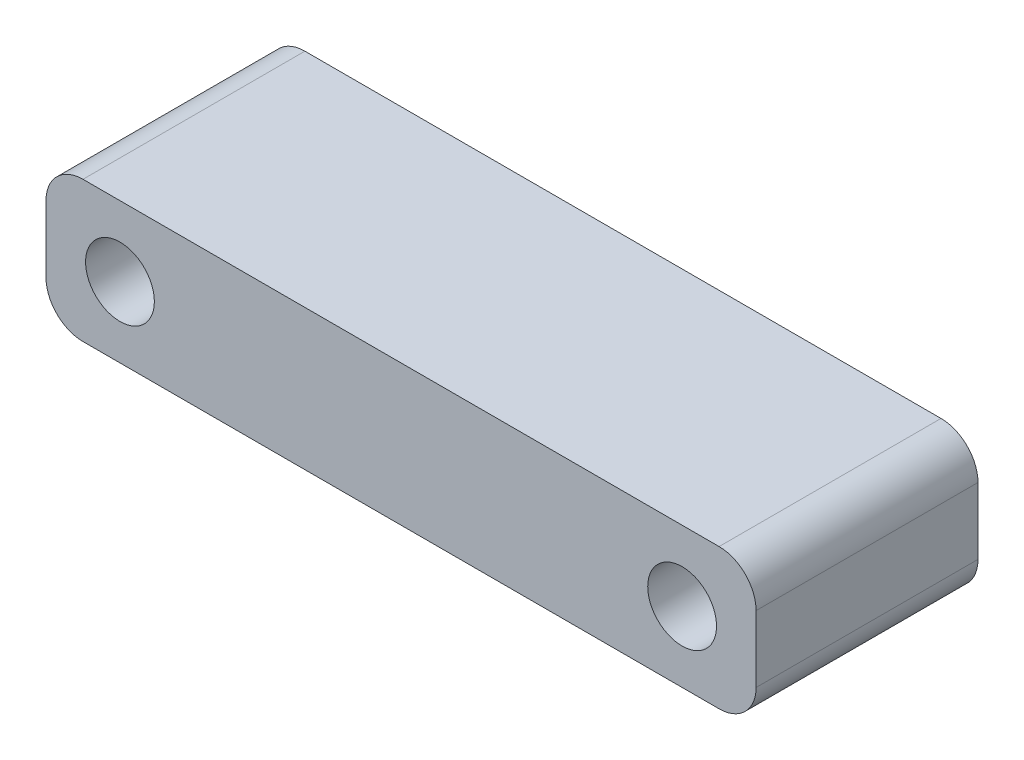
ISO-10303-21;
HEADER;
FILE_DESCRIPTION(('STEP AP214'),'2;1');
FILE_NAME('part.step','',(''),(''),'','','');
FILE_SCHEMA(('AUTOMOTIVE_DESIGN { 1 0 10303 214 1 1 1 1 }'));
ENDSEC;
DATA;
#1=APPLICATION_CONTEXT('core data for automotive mechanical design processes');
#2=APPLICATION_PROTOCOL_DEFINITION('international standard','automotive_design',2000,#1);
#3=PRODUCT_CONTEXT('',#1,'mechanical');
#4=PRODUCT('Part','Part','',(#3));
#5=PRODUCT_RELATED_PRODUCT_CATEGORY('part','',(#4));
#6=PRODUCT_DEFINITION_FORMATION('','',#4);
#7=PRODUCT_DEFINITION_CONTEXT('part definition',#1,'design');
#8=PRODUCT_DEFINITION('design','',#6,#7);
#9=PRODUCT_DEFINITION_SHAPE('','',#8);
#10=(LENGTH_UNIT() NAMED_UNIT(*) SI_UNIT(.MILLI.,.METRE.));
#11=(NAMED_UNIT(*) PLANE_ANGLE_UNIT() SI_UNIT($,.RADIAN.));
#12=(NAMED_UNIT(*) SI_UNIT($,.STERADIAN.) SOLID_ANGLE_UNIT());
#13=UNCERTAINTY_MEASURE_WITH_UNIT(LENGTH_MEASURE(1.E-05),#10,'distance_accuracy_value','');
#14=(GEOMETRIC_REPRESENTATION_CONTEXT(3) GLOBAL_UNCERTAINTY_ASSIGNED_CONTEXT((#13)) GLOBAL_UNIT_ASSIGNED_CONTEXT((#10,
#11,#12)) REPRESENTATION_CONTEXT('',''));
#15=CARTESIAN_POINT('',(0.,0.,0.));
#16=DIRECTION('',(0.,0.,1.));
#17=DIRECTION('',(1.,0.,0.));
#18=AXIS2_PLACEMENT_3D('',#15,#16,#17);
#19=CARTESIAN_POINT('',(0.,0.,30.));
#20=DIRECTION('',(0.,0.,1.));
#21=DIRECTION('',(1.,0.,0.));
#22=AXIS2_PLACEMENT_3D('',#19,#20,#21);
#23=PLANE('',#22);
#24=CARTESIAN_POINT('',(-38.,0.,30.));
#25=DIRECTION('',(0.,0.,1.));
#26=DIRECTION('',(1.,0.,0.));
#27=AXIS2_PLACEMENT_3D('',#24,#25,#26);
#28=CIRCLE('',#27,4.65);
#29=CARTESIAN_POINT('',(-33.35,0.,30.));
#30=VERTEX_POINT('',#29);
#31=EDGE_CURVE('E176',#30,#30,#28,.T.);
#32=ORIENTED_EDGE('',*,*,#31,.F.);
#33=EDGE_LOOP('',(#32));
#34=FACE_BOUND('',#33,.T.);
#35=DIRECTION('',(0.,-1.,0.));
#36=VECTOR('',#35,1.);
#37=CARTESIAN_POINT('',(-48.,9.5,30.));
#38=LINE('',#37,#36);
#39=CARTESIAN_POINT('',(-48.,4.5,30.));
#40=VERTEX_POINT('',#39);
#41=CARTESIAN_POINT('',(-48.,-4.5,30.));
#42=VERTEX_POINT('',#41);
#43=EDGE_CURVE('E180',#40,#42,#38,.T.);
#44=ORIENTED_EDGE('',*,*,#43,.T.);
#45=CARTESIAN_POINT('',(-43.,-4.5,30.));
#46=DIRECTION('',(0.,0.,1.));
#47=DIRECTION('',(1.,0.,0.));
#48=AXIS2_PLACEMENT_3D('',#45,#46,#47);
#49=CIRCLE('',#48,5.);
#50=CARTESIAN_POINT('',(-43.,-9.5,30.));
#51=VERTEX_POINT('',#50);
#52=EDGE_CURVE('E157',#42,#51,#49,.T.);
#53=ORIENTED_EDGE('',*,*,#52,.T.);
#54=DIRECTION('',(1.,0.,0.));
#55=VECTOR('',#54,1.);
#56=CARTESIAN_POINT('',(-48.,-9.5,30.));
#57=LINE('',#56,#55);
#58=CARTESIAN_POINT('',(43.,-9.5,30.));
#59=VERTEX_POINT('',#58);
#60=EDGE_CURVE('E128',#51,#59,#57,.T.);
#61=ORIENTED_EDGE('',*,*,#60,.T.);
#62=CARTESIAN_POINT('',(43.,-4.5,30.));
#63=DIRECTION('',(0.,0.,1.));
#64=DIRECTION('',(1.,0.,0.));
#65=AXIS2_PLACEMENT_3D('',#62,#63,#64);
#66=CIRCLE('',#65,5.);
#67=CARTESIAN_POINT('',(48.,-4.5,30.));
#68=VERTEX_POINT('',#67);
#69=EDGE_CURVE('E153',#59,#68,#66,.T.);
#70=ORIENTED_EDGE('',*,*,#69,.T.);
#71=DIRECTION('',(0.,1.,0.));
#72=VECTOR('',#71,1.);
#73=CARTESIAN_POINT('',(48.,9.5,30.));
#74=LINE('',#73,#72);
#75=CARTESIAN_POINT('',(48.,4.5,30.));
#76=VERTEX_POINT('',#75);
#77=EDGE_CURVE('E136',#68,#76,#74,.T.);
#78=ORIENTED_EDGE('',*,*,#77,.T.);
#79=CARTESIAN_POINT('',(43.,4.5,30.));
#80=DIRECTION('',(0.,0.,1.));
#81=DIRECTION('',(1.,0.,0.));
#82=AXIS2_PLACEMENT_3D('',#79,#80,#81);
#83=CIRCLE('',#82,5.);
#84=CARTESIAN_POINT('',(43.,9.5,30.));
#85=VERTEX_POINT('',#84);
#86=EDGE_CURVE('E63',#76,#85,#83,.T.);
#87=ORIENTED_EDGE('',*,*,#86,.T.);
#88=DIRECTION('',(-1.,0.,0.));
#89=VECTOR('',#88,1.);
#90=CARTESIAN_POINT('',(-48.,9.5,30.));
#91=LINE('',#90,#89);
#92=CARTESIAN_POINT('',(-43.,9.5,30.));
#93=VERTEX_POINT('',#92);
#94=EDGE_CURVE('E139',#85,#93,#91,.T.);
#95=ORIENTED_EDGE('',*,*,#94,.T.);
#96=CARTESIAN_POINT('',(-43.,4.5,30.));
#97=DIRECTION('',(0.,0.,1.));
#98=DIRECTION('',(1.,0.,0.));
#99=AXIS2_PLACEMENT_3D('',#96,#97,#98);
#100=CIRCLE('',#99,5.);
#101=EDGE_CURVE('E155',#93,#40,#100,.T.);
#102=ORIENTED_EDGE('',*,*,#101,.T.);
#103=EDGE_LOOP('',(#44,#53,#61,#70,#78,#87,#95,#102));
#104=FACE_BOUND('',#103,.T.);
#105=CARTESIAN_POINT('',(38.,0.,30.));
#106=DIRECTION('',(0.,0.,1.));
#107=DIRECTION('',(-1.,0.,0.));
#108=AXIS2_PLACEMENT_3D('',#105,#106,#107);
#109=CIRCLE('',#108,4.65);
#110=CARTESIAN_POINT('',(33.35,0.,30.));
#111=VERTEX_POINT('',#110);
#112=EDGE_CURVE('E186',#111,#111,#109,.T.);
#113=ORIENTED_EDGE('',*,*,#112,.F.);
#114=EDGE_LOOP('',(#113));
#115=FACE_BOUND('',#114,.T.);
#116=ADVANCED_FACE('F41',(#34,#104,#115),#23,.T.);
#117=CARTESIAN_POINT('',(0.,0.,0.));
#118=DIRECTION('',(0.,0.,1.));
#119=DIRECTION('',(1.,0.,0.));
#120=AXIS2_PLACEMENT_3D('',#117,#118,#119);
#121=PLANE('',#120);
#122=DIRECTION('',(1.,0.,0.));
#123=VECTOR('',#122,1.);
#124=CARTESIAN_POINT('',(-48.,-9.5,0.));
#125=LINE('',#124,#123);
#126=CARTESIAN_POINT('',(-43.,-9.5,0.));
#127=VERTEX_POINT('',#126);
#128=CARTESIAN_POINT('',(43.,-9.5,0.));
#129=VERTEX_POINT('',#128);
#130=EDGE_CURVE('E125',#127,#129,#125,.T.);
#131=ORIENTED_EDGE('',*,*,#130,.F.);
#132=CARTESIAN_POINT('',(-43.,-4.5,0.));
#133=DIRECTION('',(0.,0.,1.));
#134=DIRECTION('',(1.,0.,0.));
#135=AXIS2_PLACEMENT_3D('',#132,#133,#134);
#136=CIRCLE('',#135,5.);
#137=CARTESIAN_POINT('',(-48.,-4.5,0.));
#138=VERTEX_POINT('',#137);
#139=EDGE_CURVE('E108',#127,#138,#136,.F.);
#140=ORIENTED_EDGE('',*,*,#139,.T.);
#141=DIRECTION('',(0.,-1.,0.));
#142=VECTOR('',#141,1.);
#143=CARTESIAN_POINT('',(-48.,9.5,0.));
#144=LINE('',#143,#142);
#145=CARTESIAN_POINT('',(-48.,4.5,0.));
#146=VERTEX_POINT('',#145);
#147=EDGE_CURVE('E137',#146,#138,#144,.T.);
#148=ORIENTED_EDGE('',*,*,#147,.F.);
#149=CARTESIAN_POINT('',(-43.,4.5,0.));
#150=DIRECTION('',(0.,0.,1.));
#151=DIRECTION('',(1.,0.,0.));
#152=AXIS2_PLACEMENT_3D('',#149,#150,#151);
#153=CIRCLE('',#152,5.);
#154=CARTESIAN_POINT('',(-43.,9.5,0.));
#155=VERTEX_POINT('',#154);
#156=EDGE_CURVE('E119',#146,#155,#153,.F.);
#157=ORIENTED_EDGE('',*,*,#156,.T.);
#158=DIRECTION('',(-1.,0.,0.));
#159=VECTOR('',#158,1.);
#160=CARTESIAN_POINT('',(-48.,9.5,0.));
#161=LINE('',#160,#159);
#162=CARTESIAN_POINT('',(43.,9.5,0.));
#163=VERTEX_POINT('',#162);
#164=EDGE_CURVE('E141',#163,#155,#161,.T.);
#165=ORIENTED_EDGE('',*,*,#164,.F.);
#166=CARTESIAN_POINT('',(43.,4.5,0.));
#167=DIRECTION('',(0.,0.,1.));
#168=DIRECTION('',(1.,0.,0.));
#169=AXIS2_PLACEMENT_3D('',#166,#167,#168);
#170=CIRCLE('',#169,5.);
#171=CARTESIAN_POINT('',(48.,4.5,0.));
#172=VERTEX_POINT('',#171);
#173=EDGE_CURVE('E129',#163,#172,#170,.F.);
#174=ORIENTED_EDGE('',*,*,#173,.T.);
#175=DIRECTION('',(0.,1.,0.));
#176=VECTOR('',#175,1.);
#177=CARTESIAN_POINT('',(48.,9.5,0.));
#178=LINE('',#177,#176);
#179=CARTESIAN_POINT('',(48.,-4.5,0.));
#180=VERTEX_POINT('',#179);
#181=EDGE_CURVE('E168',#180,#172,#178,.T.);
#182=ORIENTED_EDGE('',*,*,#181,.F.);
#183=CARTESIAN_POINT('',(43.,-4.5,0.));
#184=DIRECTION('',(0.,0.,1.));
#185=DIRECTION('',(1.,0.,0.));
#186=AXIS2_PLACEMENT_3D('',#183,#184,#185);
#187=CIRCLE('',#186,5.);
#188=EDGE_CURVE('E135',#180,#129,#187,.F.);
#189=ORIENTED_EDGE('',*,*,#188,.T.);
#190=EDGE_LOOP('',(#131,#140,#148,#157,#165,#174,#182,#189));
#191=FACE_BOUND('',#190,.T.);
#192=CARTESIAN_POINT('',(-38.,0.,0.));
#193=DIRECTION('',(0.,0.,1.));
#194=DIRECTION('',(1.,0.,0.));
#195=AXIS2_PLACEMENT_3D('',#192,#193,#194);
#196=CIRCLE('',#195,4.65);
#197=CARTESIAN_POINT('',(-33.35,0.,0.));
#198=VERTEX_POINT('',#197);
#199=EDGE_CURVE('E183',#198,#198,#196,.T.);
#200=ORIENTED_EDGE('',*,*,#199,.T.);
#201=EDGE_LOOP('',(#200));
#202=FACE_BOUND('',#201,.T.);
#203=CARTESIAN_POINT('',(38.,0.,0.));
#204=DIRECTION('',(0.,0.,1.));
#205=DIRECTION('',(-1.,0.,0.));
#206=AXIS2_PLACEMENT_3D('',#203,#204,#205);
#207=CIRCLE('',#206,4.65);
#208=CARTESIAN_POINT('',(33.35,0.,0.));
#209=VERTEX_POINT('',#208);
#210=EDGE_CURVE('E189',#209,#209,#207,.T.);
#211=ORIENTED_EDGE('',*,*,#210,.T.);
#212=EDGE_LOOP('',(#211));
#213=FACE_BOUND('',#212,.T.);
#214=ADVANCED_FACE('F132',(#191,#202,#213),#121,.F.);
#215=CARTESIAN_POINT('',(48.,9.5,30.));
#216=DIRECTION('',(-1.,0.,0.));
#217=DIRECTION('',(0.,0.,1.));
#218=AXIS2_PLACEMENT_3D('',#215,#216,#217);
#219=PLANE('',#218);
#220=ORIENTED_EDGE('',*,*,#77,.F.);
#221=DIRECTION('',(0.,0.,-1.));
#222=VECTOR('',#221,1.);
#223=CARTESIAN_POINT('',(48.,-4.5,30.));
#224=LINE('',#223,#222);
#225=EDGE_CURVE('E11',#68,#180,#224,.T.);
#226=ORIENTED_EDGE('',*,*,#225,.T.);
#227=ORIENTED_EDGE('',*,*,#181,.T.);
#228=DIRECTION('',(0.,0.,-1.));
#229=VECTOR('',#228,1.);
#230=CARTESIAN_POINT('',(48.,4.5,30.));
#231=LINE('',#230,#229);
#232=EDGE_CURVE('E49',#172,#76,#231,.F.);
#233=ORIENTED_EDGE('',*,*,#232,.T.);
#234=EDGE_LOOP('',(#220,#226,#227,#233));
#235=FACE_BOUND('',#234,.T.);
#236=ADVANCED_FACE('F166',(#235),#219,.F.);
#237=CARTESIAN_POINT('',(-48.,9.5,30.));
#238=DIRECTION('',(0.,-1.,0.));
#239=DIRECTION('',(0.,0.,-1.));
#240=AXIS2_PLACEMENT_3D('',#237,#238,#239);
#241=PLANE('',#240);
#242=ORIENTED_EDGE('',*,*,#164,.T.);
#243=DIRECTION('',(0.,0.,-1.));
#244=VECTOR('',#243,1.);
#245=CARTESIAN_POINT('',(-43.,9.5,30.));
#246=LINE('',#245,#244);
#247=EDGE_CURVE('E56',#155,#93,#246,.F.);
#248=ORIENTED_EDGE('',*,*,#247,.T.);
#249=ORIENTED_EDGE('',*,*,#94,.F.);
#250=DIRECTION('',(0.,0.,-1.));
#251=VECTOR('',#250,1.);
#252=CARTESIAN_POINT('',(43.,9.5,30.));
#253=LINE('',#252,#251);
#254=EDGE_CURVE('E159',#85,#163,#253,.T.);
#255=ORIENTED_EDGE('',*,*,#254,.T.);
#256=EDGE_LOOP('',(#242,#248,#249,#255));
#257=FACE_BOUND('',#256,.T.);
#258=ADVANCED_FACE('F175',(#257),#241,.F.);
#259=CARTESIAN_POINT('',(-48.,9.5,30.));
#260=DIRECTION('',(1.,0.,0.));
#261=DIRECTION('',(0.,0.,-1.));
#262=AXIS2_PLACEMENT_3D('',#259,#260,#261);
#263=PLANE('',#262);
#264=ORIENTED_EDGE('',*,*,#147,.T.);
#265=DIRECTION('',(0.,0.,-1.));
#266=VECTOR('',#265,1.);
#267=CARTESIAN_POINT('',(-48.,-4.5,30.));
#268=LINE('',#267,#266);
#269=EDGE_CURVE('E113',#138,#42,#268,.F.);
#270=ORIENTED_EDGE('',*,*,#269,.T.);
#271=ORIENTED_EDGE('',*,*,#43,.F.);
#272=DIRECTION('',(0.,0.,-1.));
#273=VECTOR('',#272,1.);
#274=CARTESIAN_POINT('',(-48.,4.5,30.));
#275=LINE('',#274,#273);
#276=EDGE_CURVE('E118',#40,#146,#275,.T.);
#277=ORIENTED_EDGE('',*,*,#276,.T.);
#278=EDGE_LOOP('',(#264,#270,#271,#277));
#279=FACE_BOUND('',#278,.T.);
#280=ADVANCED_FACE('F212',(#279),#263,.F.);
#281=CARTESIAN_POINT('',(-48.,-9.5,30.));
#282=DIRECTION('',(0.,1.,0.));
#283=DIRECTION('',(0.,0.,1.));
#284=AXIS2_PLACEMENT_3D('',#281,#282,#283);
#285=PLANE('',#284);
#286=ORIENTED_EDGE('',*,*,#60,.F.);
#287=DIRECTION('',(0.,0.,-1.));
#288=VECTOR('',#287,1.);
#289=CARTESIAN_POINT('',(-43.,-9.5,30.));
#290=LINE('',#289,#288);
#291=EDGE_CURVE('E112',#51,#127,#290,.T.);
#292=ORIENTED_EDGE('',*,*,#291,.T.);
#293=ORIENTED_EDGE('',*,*,#130,.T.);
#294=DIRECTION('',(0.,0.,-1.));
#295=VECTOR('',#294,1.);
#296=CARTESIAN_POINT('',(43.,-9.5,30.));
#297=LINE('',#296,#295);
#298=EDGE_CURVE('E130',#129,#59,#297,.F.);
#299=ORIENTED_EDGE('',*,*,#298,.T.);
#300=EDGE_LOOP('',(#286,#292,#293,#299));
#301=FACE_BOUND('',#300,.T.);
#302=ADVANCED_FACE('F124',(#301),#285,.F.);
#303=CARTESIAN_POINT('',(-38.,0.,30.));
#304=DIRECTION('',(0.,0.,-1.));
#305=DIRECTION('',(-1.,0.,0.));
#306=AXIS2_PLACEMENT_3D('',#303,#304,#305);
#307=CYLINDRICAL_SURFACE('',#306,4.65);
#308=ORIENTED_EDGE('',*,*,#31,.T.);
#309=EDGE_LOOP('',(#308));
#310=FACE_BOUND('',#309,.T.);
#311=ORIENTED_EDGE('',*,*,#199,.F.);
#312=EDGE_LOOP('',(#311));
#313=FACE_BOUND('',#312,.T.);
#314=ADVANCED_FACE('F207',(#310,#313),#307,.F.);
#315=CARTESIAN_POINT('',(38.,0.,30.));
#316=DIRECTION('',(0.,0.,-1.));
#317=DIRECTION('',(-1.,0.,0.));
#318=AXIS2_PLACEMENT_3D('',#315,#316,#317);
#319=CYLINDRICAL_SURFACE('',#318,4.65);
#320=ORIENTED_EDGE('',*,*,#112,.T.);
#321=EDGE_LOOP('',(#320));
#322=FACE_BOUND('',#321,.T.);
#323=ORIENTED_EDGE('',*,*,#210,.F.);
#324=EDGE_LOOP('',(#323));
#325=FACE_BOUND('',#324,.T.);
#326=ADVANCED_FACE('F195',(#322,#325),#319,.F.);
#327=CARTESIAN_POINT('',(-43.,-4.5,30.));
#328=DIRECTION('',(0.,0.,-1.));
#329=DIRECTION('',(-1.,0.,0.));
#330=AXIS2_PLACEMENT_3D('',#327,#328,#329);
#331=CYLINDRICAL_SURFACE('',#330,5.);
#332=ORIENTED_EDGE('',*,*,#52,.F.);
#333=ORIENTED_EDGE('',*,*,#269,.F.);
#334=ORIENTED_EDGE('',*,*,#139,.F.);
#335=ORIENTED_EDGE('',*,*,#291,.F.);
#336=EDGE_LOOP('',(#332,#333,#334,#335));
#337=FACE_BOUND('',#336,.T.);
#338=ADVANCED_FACE('F111',(#337),#331,.T.);
#339=CARTESIAN_POINT('',(-43.,4.5,30.));
#340=DIRECTION('',(0.,0.,-1.));
#341=DIRECTION('',(-1.,0.,0.));
#342=AXIS2_PLACEMENT_3D('',#339,#340,#341);
#343=CYLINDRICAL_SURFACE('',#342,5.);
#344=ORIENTED_EDGE('',*,*,#101,.F.);
#345=ORIENTED_EDGE('',*,*,#247,.F.);
#346=ORIENTED_EDGE('',*,*,#156,.F.);
#347=ORIENTED_EDGE('',*,*,#276,.F.);
#348=EDGE_LOOP('',(#344,#345,#346,#347));
#349=FACE_BOUND('',#348,.T.);
#350=ADVANCED_FACE('F222',(#349),#343,.T.);
#351=CARTESIAN_POINT('',(43.,-4.5,30.));
#352=DIRECTION('',(0.,0.,-1.));
#353=DIRECTION('',(-1.,0.,0.));
#354=AXIS2_PLACEMENT_3D('',#351,#352,#353);
#355=CYLINDRICAL_SURFACE('',#354,5.);
#356=ORIENTED_EDGE('',*,*,#69,.F.);
#357=ORIENTED_EDGE('',*,*,#298,.F.);
#358=ORIENTED_EDGE('',*,*,#188,.F.);
#359=ORIENTED_EDGE('',*,*,#225,.F.);
#360=EDGE_LOOP('',(#356,#357,#358,#359));
#361=FACE_BOUND('',#360,.T.);
#362=ADVANCED_FACE('F224',(#361),#355,.T.);
#363=CARTESIAN_POINT('',(43.,4.5,30.));
#364=DIRECTION('',(0.,0.,-1.));
#365=DIRECTION('',(-1.,0.,0.));
#366=AXIS2_PLACEMENT_3D('',#363,#364,#365);
#367=CYLINDRICAL_SURFACE('',#366,5.);
#368=ORIENTED_EDGE('',*,*,#86,.F.);
#369=ORIENTED_EDGE('',*,*,#232,.F.);
#370=ORIENTED_EDGE('',*,*,#173,.F.);
#371=ORIENTED_EDGE('',*,*,#254,.F.);
#372=EDGE_LOOP('',(#368,#369,#370,#371));
#373=FACE_BOUND('',#372,.T.);
#374=ADVANCED_FACE('F43',(#373),#367,.T.);
#375=CLOSED_SHELL('',(#116,#214,#236,#258,#280,#302,#314,#326,#338,#350,#362,#374));
#376=MANIFOLD_SOLID_BREP('B2',#375);
#377=ADVANCED_BREP_SHAPE_REPRESENTATION('',(#18,#376),#14);
#378=SHAPE_DEFINITION_REPRESENTATION(#9,#377);
ENDSEC;
END-ISO-10303-21;
